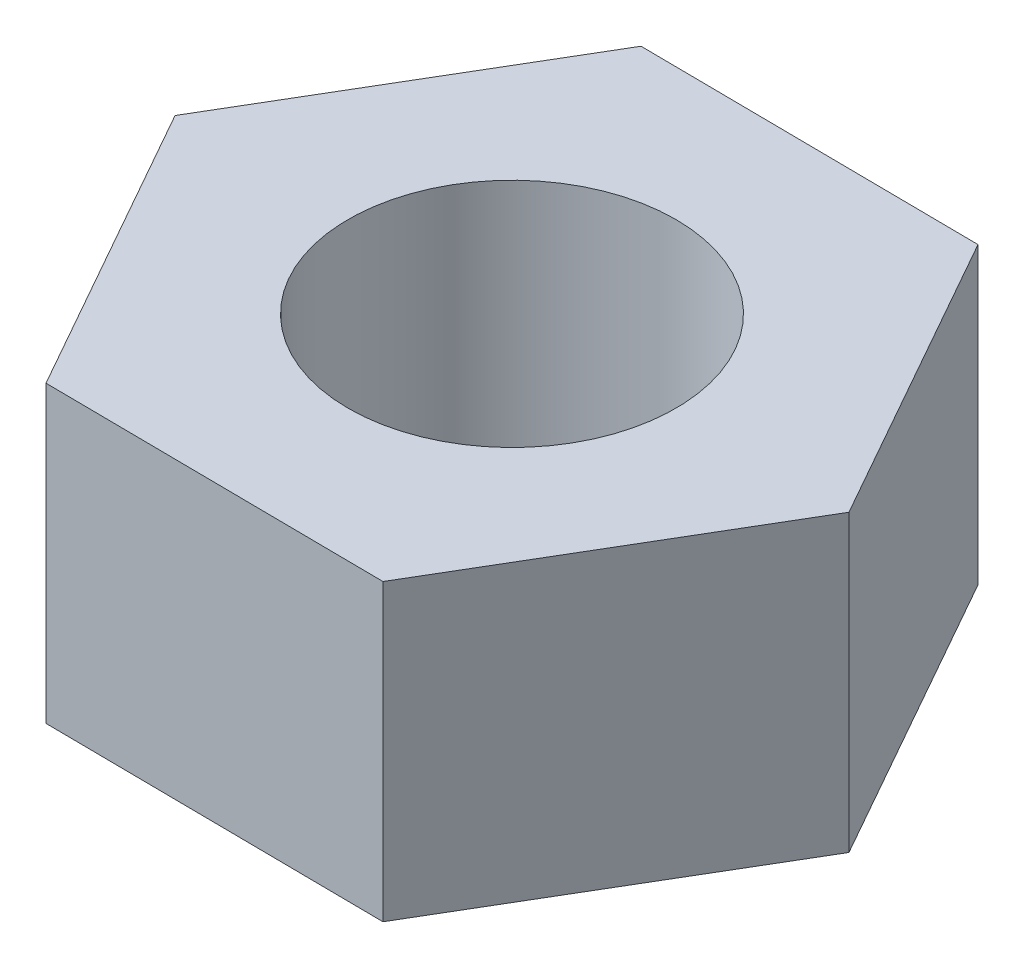
ISO-10303-21;
HEADER;
FILE_DESCRIPTION(('STEP AP214'),'2;1');
FILE_NAME('part.step','',(''),(''),'','','');
FILE_SCHEMA(('AUTOMOTIVE_DESIGN { 1 0 10303 214 1 1 1 1 }'));
ENDSEC;
DATA;
#1=APPLICATION_CONTEXT('core data for automotive mechanical design processes');
#2=APPLICATION_PROTOCOL_DEFINITION('international standard','automotive_design',2000,#1);
#3=PRODUCT_CONTEXT('',#1,'mechanical');
#4=PRODUCT('Part','Part','',(#3));
#5=PRODUCT_RELATED_PRODUCT_CATEGORY('part','',(#4));
#6=PRODUCT_DEFINITION_FORMATION('','',#4);
#7=PRODUCT_DEFINITION_CONTEXT('part definition',#1,'design');
#8=PRODUCT_DEFINITION('design','',#6,#7);
#9=PRODUCT_DEFINITION_SHAPE('','',#8);
#10=(LENGTH_UNIT() NAMED_UNIT(*) SI_UNIT(.MILLI.,.METRE.));
#11=(NAMED_UNIT(*) PLANE_ANGLE_UNIT() SI_UNIT($,.RADIAN.));
#12=(NAMED_UNIT(*) SI_UNIT($,.STERADIAN.) SOLID_ANGLE_UNIT());
#13=UNCERTAINTY_MEASURE_WITH_UNIT(LENGTH_MEASURE(1.E-05),#10,'distance_accuracy_value','');
#14=(GEOMETRIC_REPRESENTATION_CONTEXT(3) GLOBAL_UNCERTAINTY_ASSIGNED_CONTEXT((#13)) GLOBAL_UNIT_ASSIGNED_CONTEXT((#10,
#11,#12)) REPRESENTATION_CONTEXT('',''));
#15=CARTESIAN_POINT('',(0.,0.,0.));
#16=DIRECTION('',(0.,0.,1.));
#17=DIRECTION('',(1.,0.,0.));
#18=AXIS2_PLACEMENT_3D('',#15,#16,#17);
#19=CARTESIAN_POINT('',(0.,4.5,0.));
#20=DIRECTION('',(0.,1.,0.));
#21=DIRECTION('',(0.,0.,1.));
#22=AXIS2_PLACEMENT_3D('',#19,#20,#21);
#23=PLANE('',#22);
#24=DIRECTION('',(-0.491573195949679,0.,-0.870836260742408));
#25=VECTOR('',#24,1.);
#26=CARTESIAN_POINT('',(5.19590779987662,4.5,0.0504195912451664));
#27=LINE('',#26,#25);
#28=CARTESIAN_POINT('',(5.19590779987662,4.5,0.0504195912451664));
#29=VERTEX_POINT('',#28);
#30=CARTESIAN_POINT('',(2.64161854680505,4.5,-4.47457835479228));
#31=VERTEX_POINT('',#30);
#32=EDGE_CURVE('E129',#29,#31,#27,.T.);
#33=ORIENTED_EDGE('',*,*,#32,.T.);
#34=DIRECTION('',(-0.999952922314414,0.,-0.0097032548592765));
#35=VECTOR('',#34,1.);
#36=CARTESIAN_POINT('',(2.64161854680505,4.5,-4.47457835479228));
#37=LINE('',#36,#35);
#38=CARTESIAN_POINT('',(-2.55428925307157,4.5,-4.52499794603745));
#39=VERTEX_POINT('',#38);
#40=EDGE_CURVE('E87',#31,#39,#37,.T.);
#41=ORIENTED_EDGE('',*,*,#40,.T.);
#42=DIRECTION('',(-0.508379726364734,0.,0.861133005883132));
#43=VECTOR('',#42,1.);
#44=CARTESIAN_POINT('',(-2.55428925307157,4.5,-4.52499794603745));
#45=LINE('',#44,#43);
#46=CARTESIAN_POINT('',(-5.19590779987662,4.5,-0.0504195912451679));
#47=VERTEX_POINT('',#46);
#48=EDGE_CURVE('E100',#39,#47,#45,.T.);
#49=ORIENTED_EDGE('',*,*,#48,.T.);
#50=DIRECTION('',(0.491573195949679,0.,0.870836260742407));
#51=VECTOR('',#50,1.);
#52=CARTESIAN_POINT('',(-5.19590779987662,4.5,-0.0504195912451679));
#53=LINE('',#52,#51);
#54=CARTESIAN_POINT('',(-2.64161854680505,4.5,4.47457835479228));
#55=VERTEX_POINT('',#54);
#56=EDGE_CURVE('E94',#47,#55,#53,.T.);
#57=ORIENTED_EDGE('',*,*,#56,.T.);
#58=DIRECTION('',(0.999952922314414,0.,0.00970325485927684));
#59=VECTOR('',#58,1.);
#60=CARTESIAN_POINT('',(-2.64161854680505,4.5,4.47457835479228));
#61=LINE('',#60,#59);
#62=CARTESIAN_POINT('',(2.55428925307157,4.5,4.52499794603745));
#63=VERTEX_POINT('',#62);
#64=EDGE_CURVE('E98',#55,#63,#61,.T.);
#65=ORIENTED_EDGE('',*,*,#64,.T.);
#66=DIRECTION('',(0.508379726364735,0.,-0.861133005883132));
#67=VECTOR('',#66,1.);
#68=CARTESIAN_POINT('',(2.55428925307157,4.5,4.52499794603745));
#69=LINE('',#68,#67);
#70=EDGE_CURVE('E50',#63,#29,#69,.T.);
#71=ORIENTED_EDGE('',*,*,#70,.T.);
#72=EDGE_LOOP('',(#33,#41,#49,#57,#65,#71));
#73=FACE_BOUND('',#72,.T.);
#74=CARTESIAN_POINT('',(0.,4.5,0.));
#75=DIRECTION('',(0.,1.,0.));
#76=DIRECTION('',(0.,0.,1.));
#77=AXIS2_PLACEMENT_3D('',#74,#75,#76);
#78=CIRCLE('',#77,2.5);
#79=CARTESIAN_POINT('',(0.,4.5,2.5));
#80=VERTEX_POINT('',#79);
#81=EDGE_CURVE('E122',#80,#80,#78,.T.);
#82=ORIENTED_EDGE('',*,*,#81,.F.);
#83=EDGE_LOOP('',(#82));
#84=FACE_BOUND('',#83,.T.);
#85=ADVANCED_FACE('F33',(#73,#84),#23,.T.);
#86=CARTESIAN_POINT('',(0.,0.,0.));
#87=DIRECTION('',(0.,1.,0.));
#88=DIRECTION('',(0.,0.,1.));
#89=AXIS2_PLACEMENT_3D('',#86,#87,#88);
#90=PLANE('',#89);
#91=DIRECTION('',(-0.491573195949679,0.,-0.870836260742408));
#92=VECTOR('',#91,1.);
#93=CARTESIAN_POINT('',(5.19590779987662,0.,0.0504195912451664));
#94=LINE('',#93,#92);
#95=CARTESIAN_POINT('',(5.19590779987662,0.,0.0504195912451664));
#96=VERTEX_POINT('',#95);
#97=CARTESIAN_POINT('',(2.64161854680505,0.,-4.47457835479228));
#98=VERTEX_POINT('',#97);
#99=EDGE_CURVE('E118',#96,#98,#94,.T.);
#100=ORIENTED_EDGE('',*,*,#99,.F.);
#101=DIRECTION('',(0.508379726364735,0.,-0.861133005883132));
#102=VECTOR('',#101,1.);
#103=CARTESIAN_POINT('',(2.55428925307157,0.,4.52499794603745));
#104=LINE('',#103,#102);
#105=CARTESIAN_POINT('',(2.55428925307157,0.,4.52499794603745));
#106=VERTEX_POINT('',#105);
#107=EDGE_CURVE('E79',#106,#96,#104,.T.);
#108=ORIENTED_EDGE('',*,*,#107,.F.);
#109=DIRECTION('',(0.999952922314414,0.,0.00970325485927684));
#110=VECTOR('',#109,1.);
#111=CARTESIAN_POINT('',(-2.64161854680505,0.,4.47457835479228));
#112=LINE('',#111,#110);
#113=CARTESIAN_POINT('',(-2.64161854680505,0.,4.47457835479228));
#114=VERTEX_POINT('',#113);
#115=EDGE_CURVE('E73',#114,#106,#112,.T.);
#116=ORIENTED_EDGE('',*,*,#115,.F.);
#117=DIRECTION('',(0.491573195949679,0.,0.870836260742407));
#118=VECTOR('',#117,1.);
#119=CARTESIAN_POINT('',(-5.19590779987662,0.,-0.0504195912451679));
#120=LINE('',#119,#118);
#121=CARTESIAN_POINT('',(-5.19590779987662,0.,-0.0504195912451679));
#122=VERTEX_POINT('',#121);
#123=EDGE_CURVE('E108',#122,#114,#120,.T.);
#124=ORIENTED_EDGE('',*,*,#123,.F.);
#125=DIRECTION('',(-0.508379726364734,0.,0.861133005883132));
#126=VECTOR('',#125,1.);
#127=CARTESIAN_POINT('',(-2.55428925307157,0.,-4.52499794603745));
#128=LINE('',#127,#126);
#129=CARTESIAN_POINT('',(-2.55428925307157,0.,-4.52499794603745));
#130=VERTEX_POINT('',#129);
#131=EDGE_CURVE('E124',#130,#122,#128,.T.);
#132=ORIENTED_EDGE('',*,*,#131,.F.);
#133=DIRECTION('',(-0.999952922314414,0.,-0.0097032548592765));
#134=VECTOR('',#133,1.);
#135=CARTESIAN_POINT('',(2.64161854680505,0.,-4.47457835479228));
#136=LINE('',#135,#134);
#137=EDGE_CURVE('E121',#98,#130,#136,.T.);
#138=ORIENTED_EDGE('',*,*,#137,.F.);
#139=EDGE_LOOP('',(#100,#108,#116,#124,#132,#138));
#140=FACE_BOUND('',#139,.T.);
#141=CARTESIAN_POINT('',(0.,0.,0.));
#142=DIRECTION('',(0.,1.,0.));
#143=DIRECTION('',(0.,0.,1.));
#144=AXIS2_PLACEMENT_3D('',#141,#142,#143);
#145=CIRCLE('',#144,2.5);
#146=CARTESIAN_POINT('',(0.,0.,2.5));
#147=VERTEX_POINT('',#146);
#148=EDGE_CURVE('E222',#147,#147,#145,.T.);
#149=ORIENTED_EDGE('',*,*,#148,.T.);
#150=EDGE_LOOP('',(#149));
#151=FACE_BOUND('',#150,.T.);
#152=ADVANCED_FACE('F138',(#140,#151),#90,.F.);
#153=CARTESIAN_POINT('',(5.19590779987662,4.5,0.0504195912451664));
#154=DIRECTION('',(-0.870836260742407,0.,0.491573195949679));
#155=DIRECTION('',(0.491573195949679,0.,0.870836260742408));
#156=AXIS2_PLACEMENT_3D('',#153,#154,#155);
#157=PLANE('',#156);
#158=ORIENTED_EDGE('',*,*,#99,.T.);
#159=DIRECTION('',(0.,-1.,0.));
#160=VECTOR('',#159,1.);
#161=CARTESIAN_POINT('',(2.64161854680505,4.5,-4.47457835479228));
#162=LINE('',#161,#160);
#163=EDGE_CURVE('E11',#31,#98,#162,.T.);
#164=ORIENTED_EDGE('',*,*,#163,.F.);
#165=ORIENTED_EDGE('',*,*,#32,.F.);
#166=DIRECTION('',(0.,-1.,0.));
#167=VECTOR('',#166,1.);
#168=CARTESIAN_POINT('',(5.19590779987662,4.5,0.0504195912451664));
#169=LINE('',#168,#167);
#170=EDGE_CURVE('E114',#29,#96,#169,.T.);
#171=ORIENTED_EDGE('',*,*,#170,.T.);
#172=EDGE_LOOP('',(#158,#164,#165,#171));
#173=FACE_BOUND('',#172,.T.);
#174=ADVANCED_FACE('F35',(#173),#157,.F.);
#175=CARTESIAN_POINT('',(2.64161854680505,4.5,-4.47457835479228));
#176=DIRECTION('',(-0.0097032548592765,0.,0.999952922314414));
#177=DIRECTION('',(0.999952922314414,0.,0.0097032548592765));
#178=AXIS2_PLACEMENT_3D('',#175,#176,#177);
#179=PLANE('',#178);
#180=ORIENTED_EDGE('',*,*,#137,.T.);
#181=DIRECTION('',(0.,-1.,0.));
#182=VECTOR('',#181,1.);
#183=CARTESIAN_POINT('',(-2.55428925307157,4.5,-4.52499794603745));
#184=LINE('',#183,#182);
#185=EDGE_CURVE('E42',#39,#130,#184,.T.);
#186=ORIENTED_EDGE('',*,*,#185,.F.);
#187=ORIENTED_EDGE('',*,*,#40,.F.);
#188=ORIENTED_EDGE('',*,*,#163,.T.);
#189=EDGE_LOOP('',(#180,#186,#187,#188));
#190=FACE_BOUND('',#189,.T.);
#191=ADVANCED_FACE('F163',(#190),#179,.F.);
#192=CARTESIAN_POINT('',(-2.55428925307157,4.5,-4.52499794603745));
#193=DIRECTION('',(0.861133005883132,0.,0.508379726364734));
#194=DIRECTION('',(0.508379726364735,0.,-0.861133005883132));
#195=AXIS2_PLACEMENT_3D('',#192,#193,#194);
#196=PLANE('',#195);
#197=ORIENTED_EDGE('',*,*,#131,.T.);
#198=DIRECTION('',(0.,-1.,0.));
#199=VECTOR('',#198,1.);
#200=CARTESIAN_POINT('',(-5.19590779987662,4.5,-0.0504195912451679));
#201=LINE('',#200,#199);
#202=EDGE_CURVE('E109',#47,#122,#201,.T.);
#203=ORIENTED_EDGE('',*,*,#202,.F.);
#204=ORIENTED_EDGE('',*,*,#48,.F.);
#205=ORIENTED_EDGE('',*,*,#185,.T.);
#206=EDGE_LOOP('',(#197,#203,#204,#205));
#207=FACE_BOUND('',#206,.T.);
#208=ADVANCED_FACE('F135',(#207),#196,.F.);
#209=CARTESIAN_POINT('',(-5.19590779987662,4.5,-0.0504195912451679));
#210=DIRECTION('',(0.870836260742407,0.,-0.491573195949679));
#211=DIRECTION('',(-0.491573195949679,0.,-0.870836260742407));
#212=AXIS2_PLACEMENT_3D('',#209,#210,#211);
#213=PLANE('',#212);
#214=ORIENTED_EDGE('',*,*,#123,.T.);
#215=DIRECTION('',(0.,-1.,0.));
#216=VECTOR('',#215,1.);
#217=CARTESIAN_POINT('',(-2.64161854680505,4.5,4.47457835479228));
#218=LINE('',#217,#216);
#219=EDGE_CURVE('E105',#55,#114,#218,.T.);
#220=ORIENTED_EDGE('',*,*,#219,.F.);
#221=ORIENTED_EDGE('',*,*,#56,.F.);
#222=ORIENTED_EDGE('',*,*,#202,.T.);
#223=EDGE_LOOP('',(#214,#220,#221,#222));
#224=FACE_BOUND('',#223,.T.);
#225=ADVANCED_FACE('F106',(#224),#213,.F.);
#226=CARTESIAN_POINT('',(-2.64161854680505,4.5,4.47457835479228));
#227=DIRECTION('',(0.00970325485927684,0.,-0.999952922314414));
#228=DIRECTION('',(-0.999952922314414,0.,-0.00970325485927684));
#229=AXIS2_PLACEMENT_3D('',#226,#227,#228);
#230=PLANE('',#229);
#231=ORIENTED_EDGE('',*,*,#115,.T.);
#232=DIRECTION('',(0.,-1.,0.));
#233=VECTOR('',#232,1.);
#234=CARTESIAN_POINT('',(2.55428925307157,4.5,4.52499794603745));
#235=LINE('',#234,#233);
#236=EDGE_CURVE('E110',#63,#106,#235,.T.);
#237=ORIENTED_EDGE('',*,*,#236,.F.);
#238=ORIENTED_EDGE('',*,*,#64,.F.);
#239=ORIENTED_EDGE('',*,*,#219,.T.);
#240=EDGE_LOOP('',(#231,#237,#238,#239));
#241=FACE_BOUND('',#240,.T.);
#242=ADVANCED_FACE('F112',(#241),#230,.F.);
#243=CARTESIAN_POINT('',(2.55428925307157,4.5,4.52499794603745));
#244=DIRECTION('',(-0.861133005883132,0.,-0.508379726364734));
#245=DIRECTION('',(-0.508379726364735,0.,0.861133005883132));
#246=AXIS2_PLACEMENT_3D('',#243,#244,#245);
#247=PLANE('',#246);
#248=ORIENTED_EDGE('',*,*,#107,.T.);
#249=ORIENTED_EDGE('',*,*,#170,.F.);
#250=ORIENTED_EDGE('',*,*,#70,.F.);
#251=ORIENTED_EDGE('',*,*,#236,.T.);
#252=EDGE_LOOP('',(#248,#249,#250,#251));
#253=FACE_BOUND('',#252,.T.);
#254=ADVANCED_FACE('F143',(#253),#247,.F.);
#255=CARTESIAN_POINT('',(0.,4.5,0.));
#256=DIRECTION('',(0.,-1.,0.));
#257=DIRECTION('',(0.,0.,-1.));
#258=AXIS2_PLACEMENT_3D('',#255,#256,#257);
#259=CYLINDRICAL_SURFACE('',#258,2.5);
#260=ORIENTED_EDGE('',*,*,#81,.T.);
#261=EDGE_LOOP('',(#260));
#262=FACE_BOUND('',#261,.T.);
#263=ORIENTED_EDGE('',*,*,#148,.F.);
#264=EDGE_LOOP('',(#263));
#265=FACE_BOUND('',#264,.T.);
#266=ADVANCED_FACE('F145',(#262,#265),#259,.F.);
#267=CLOSED_SHELL('',(#85,#152,#174,#191,#208,#225,#242,#254,#266));
#268=MANIFOLD_SOLID_BREP('B2',#267);
#269=ADVANCED_BREP_SHAPE_REPRESENTATION('',(#18,#268),#14);
#270=SHAPE_DEFINITION_REPRESENTATION(#9,#269);
ENDSEC;
END-ISO-10303-21;
